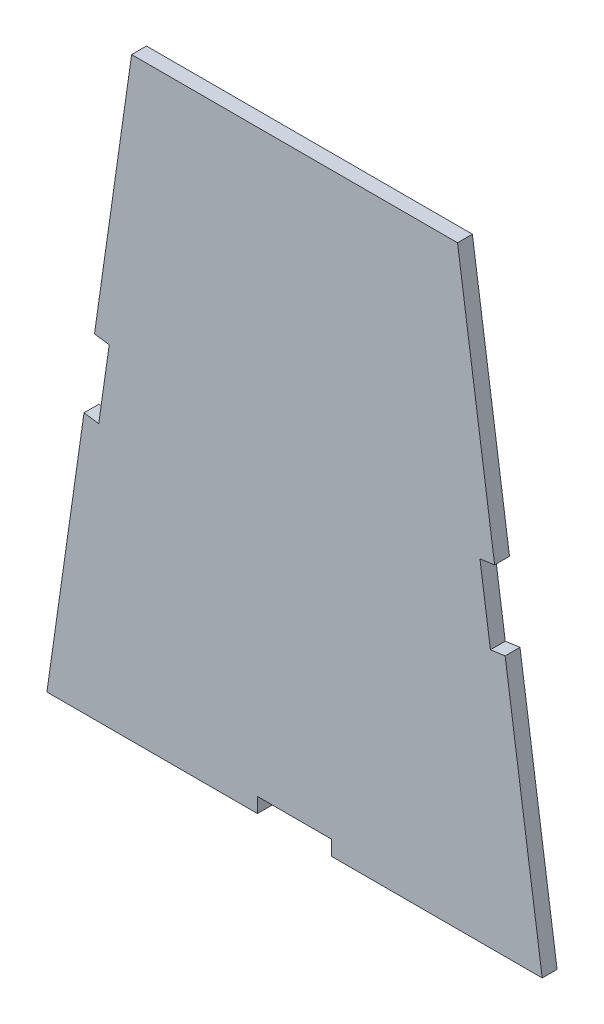
ISO-10303-21;
HEADER;
FILE_DESCRIPTION(('STEP AP214'),'2;1');
FILE_NAME('part.step','',(''),(''),'','','');
FILE_SCHEMA(('AUTOMOTIVE_DESIGN { 1 0 10303 214 1 1 1 1 }'));
ENDSEC;
DATA;
#1=APPLICATION_CONTEXT('core data for automotive mechanical design processes');
#2=APPLICATION_PROTOCOL_DEFINITION('international standard','automotive_design',2000,#1);
#3=PRODUCT_CONTEXT('',#1,'mechanical');
#4=PRODUCT('Part','Part','',(#3));
#5=PRODUCT_RELATED_PRODUCT_CATEGORY('part','',(#4));
#6=PRODUCT_DEFINITION_FORMATION('','',#4);
#7=PRODUCT_DEFINITION_CONTEXT('part definition',#1,'design');
#8=PRODUCT_DEFINITION('design','',#6,#7);
#9=PRODUCT_DEFINITION_SHAPE('','',#8);
#10=(LENGTH_UNIT() NAMED_UNIT(*) SI_UNIT(.MILLI.,.METRE.));
#11=(NAMED_UNIT(*) PLANE_ANGLE_UNIT() SI_UNIT($,.RADIAN.));
#12=(NAMED_UNIT(*) SI_UNIT($,.STERADIAN.) SOLID_ANGLE_UNIT());
#13=UNCERTAINTY_MEASURE_WITH_UNIT(LENGTH_MEASURE(1.E-05),#10,'distance_accuracy_value','');
#14=(GEOMETRIC_REPRESENTATION_CONTEXT(3) GLOBAL_UNCERTAINTY_ASSIGNED_CONTEXT((#13)) GLOBAL_UNIT_ASSIGNED_CONTEXT((#10,
#11,#12)) REPRESENTATION_CONTEXT('',''));
#15=CARTESIAN_POINT('',(0.,0.,0.));
#16=DIRECTION('',(0.,0.,1.));
#17=DIRECTION('',(1.,0.,0.));
#18=AXIS2_PLACEMENT_3D('',#15,#16,#17);
#19=CARTESIAN_POINT('',(-142.129727490012,-86.5401507185033,3.));
#20=DIRECTION('',(0.,1.,0.));
#21=DIRECTION('',(0.,0.,1.));
#22=AXIS2_PLACEMENT_3D('',#19,#20,#21);
#23=PLANE('',#22);
#24=DIRECTION('',(1.,0.,0.));
#25=VECTOR('',#24,1.);
#26=CARTESIAN_POINT('',(-142.129727490012,-86.5401507185033,0.));
#27=LINE('',#26,#25);
#28=CARTESIAN_POINT('',(-142.129727490012,-86.5401507185033,0.));
#29=VERTEX_POINT('',#28);
#30=CARTESIAN_POINT('',(-99.6297274900117,-86.5401507185033,0.));
#31=VERTEX_POINT('',#30);
#32=EDGE_CURVE('E180',#29,#31,#27,.T.);
#33=ORIENTED_EDGE('',*,*,#32,.T.);
#34=DIRECTION('',(0.,0.,-1.));
#35=VECTOR('',#34,1.);
#36=CARTESIAN_POINT('',(-99.6297274900117,-86.5401507185033,3.));
#37=LINE('',#36,#35);
#38=CARTESIAN_POINT('',(-99.6297274900117,-86.5401507185033,3.));
#39=VERTEX_POINT('',#38);
#40=EDGE_CURVE('E11',#39,#31,#37,.T.);
#41=ORIENTED_EDGE('',*,*,#40,.F.);
#42=DIRECTION('',(1.,0.,0.));
#43=VECTOR('',#42,1.);
#44=CARTESIAN_POINT('',(-142.129727490012,-86.5401507185033,3.));
#45=LINE('',#44,#43);
#46=CARTESIAN_POINT('',(-142.129727490012,-86.5401507185033,3.));
#47=VERTEX_POINT('',#46);
#48=EDGE_CURVE('E210',#47,#39,#45,.T.);
#49=ORIENTED_EDGE('',*,*,#48,.F.);
#50=DIRECTION('',(0.,0.,-1.));
#51=VECTOR('',#50,1.);
#52=CARTESIAN_POINT('',(-142.129727490012,-86.5401507185033,3.));
#53=LINE('',#52,#51);
#54=EDGE_CURVE('E176',#47,#29,#53,.T.);
#55=ORIENTED_EDGE('',*,*,#54,.T.);
#56=EDGE_LOOP('',(#33,#41,#49,#55));
#57=FACE_BOUND('',#56,.T.);
#58=ADVANCED_FACE('F36',(#57),#23,.F.);
#59=CARTESIAN_POINT('',(-99.6297274900117,-83.5401507185033,3.));
#60=DIRECTION('',(-1.,0.,0.));
#61=DIRECTION('',(0.,0.,1.));
#62=AXIS2_PLACEMENT_3D('',#59,#60,#61);
#63=PLANE('',#62);
#64=DIRECTION('',(0.,1.,0.));
#65=VECTOR('',#64,1.);
#66=CARTESIAN_POINT('',(-99.6297274900117,-83.5401507185033,0.));
#67=LINE('',#66,#65);
#68=CARTESIAN_POINT('',(-99.6297274900117,-83.5401507185033,0.));
#69=VERTEX_POINT('',#68);
#70=EDGE_CURVE('E183',#31,#69,#67,.T.);
#71=ORIENTED_EDGE('',*,*,#70,.T.);
#72=DIRECTION('',(0.,0.,-1.));
#73=VECTOR('',#72,1.);
#74=CARTESIAN_POINT('',(-99.6297274900117,-83.5401507185033,3.));
#75=LINE('',#74,#73);
#76=CARTESIAN_POINT('',(-99.6297274900117,-83.5401507185033,3.));
#77=VERTEX_POINT('',#76);
#78=EDGE_CURVE('E44',#77,#69,#75,.T.);
#79=ORIENTED_EDGE('',*,*,#78,.F.);
#80=DIRECTION('',(0.,1.,0.));
#81=VECTOR('',#80,1.);
#82=CARTESIAN_POINT('',(-99.6297274900117,-83.5401507185033,3.));
#83=LINE('',#82,#81);
#84=EDGE_CURVE('E119',#39,#77,#83,.T.);
#85=ORIENTED_EDGE('',*,*,#84,.F.);
#86=ORIENTED_EDGE('',*,*,#40,.T.);
#87=EDGE_LOOP('',(#71,#79,#85,#86));
#88=FACE_BOUND('',#87,.T.);
#89=ADVANCED_FACE('F308',(#88),#63,.F.);
#90=CARTESIAN_POINT('',(-99.6297274900117,-83.5401507185033,3.));
#91=DIRECTION('',(0.,1.,0.));
#92=DIRECTION('',(0.,0.,1.));
#93=AXIS2_PLACEMENT_3D('',#90,#91,#92);
#94=PLANE('',#93);
#95=DIRECTION('',(1.,0.,0.));
#96=VECTOR('',#95,1.);
#97=CARTESIAN_POINT('',(-99.6297274900117,-83.5401507185033,0.));
#98=LINE('',#97,#96);
#99=CARTESIAN_POINT('',(-84.6297274900117,-83.5401507185033,0.));
#100=VERTEX_POINT('',#99);
#101=EDGE_CURVE('E185',#69,#100,#98,.T.);
#102=ORIENTED_EDGE('',*,*,#101,.T.);
#103=DIRECTION('',(0.,0.,-1.));
#104=VECTOR('',#103,1.);
#105=CARTESIAN_POINT('',(-84.6297274900117,-83.5401507185033,3.));
#106=LINE('',#105,#104);
#107=CARTESIAN_POINT('',(-84.6297274900117,-83.5401507185033,3.));
#108=VERTEX_POINT('',#107);
#109=EDGE_CURVE('E241',#108,#100,#106,.T.);
#110=ORIENTED_EDGE('',*,*,#109,.F.);
#111=DIRECTION('',(1.,0.,0.));
#112=VECTOR('',#111,1.);
#113=CARTESIAN_POINT('',(-99.6297274900117,-83.5401507185033,3.));
#114=LINE('',#113,#112);
#115=EDGE_CURVE('E249',#77,#108,#114,.T.);
#116=ORIENTED_EDGE('',*,*,#115,.F.);
#117=ORIENTED_EDGE('',*,*,#78,.T.);
#118=EDGE_LOOP('',(#102,#110,#116,#117));
#119=FACE_BOUND('',#118,.T.);
#120=ADVANCED_FACE('F247',(#119),#94,.F.);
#121=CARTESIAN_POINT('',(-84.6297274900117,-83.5401507185033,3.));
#122=DIRECTION('',(1.,0.,0.));
#123=DIRECTION('',(0.,0.,-1.));
#124=AXIS2_PLACEMENT_3D('',#121,#122,#123);
#125=PLANE('',#124);
#126=DIRECTION('',(0.,-1.,0.));
#127=VECTOR('',#126,1.);
#128=CARTESIAN_POINT('',(-84.6297274900117,-83.5401507185033,0.));
#129=LINE('',#128,#127);
#130=CARTESIAN_POINT('',(-84.6297274900117,-86.5401507185033,0.));
#131=VERTEX_POINT('',#130);
#132=EDGE_CURVE('E187',#100,#131,#129,.T.);
#133=ORIENTED_EDGE('',*,*,#132,.T.);
#134=DIRECTION('',(0.,0.,-1.));
#135=VECTOR('',#134,1.);
#136=CARTESIAN_POINT('',(-84.6297274900117,-86.5401507185033,3.));
#137=LINE('',#136,#135);
#138=CARTESIAN_POINT('',(-84.6297274900117,-86.5401507185033,3.));
#139=VERTEX_POINT('',#138);
#140=EDGE_CURVE('E238',#139,#131,#137,.T.);
#141=ORIENTED_EDGE('',*,*,#140,.F.);
#142=DIRECTION('',(0.,-1.,0.));
#143=VECTOR('',#142,1.);
#144=CARTESIAN_POINT('',(-84.6297274900117,-83.5401507185033,3.));
#145=LINE('',#144,#143);
#146=EDGE_CURVE('E267',#108,#139,#145,.T.);
#147=ORIENTED_EDGE('',*,*,#146,.F.);
#148=ORIENTED_EDGE('',*,*,#109,.T.);
#149=EDGE_LOOP('',(#133,#141,#147,#148));
#150=FACE_BOUND('',#149,.T.);
#151=ADVANCED_FACE('F258',(#150),#125,.F.);
#152=CARTESIAN_POINT('',(-84.6297274900117,-86.5401507185033,3.));
#153=DIRECTION('',(0.,1.,0.));
#154=DIRECTION('',(0.,0.,1.));
#155=AXIS2_PLACEMENT_3D('',#152,#153,#154);
#156=PLANE('',#155);
#157=DIRECTION('',(1.,0.,0.));
#158=VECTOR('',#157,1.);
#159=CARTESIAN_POINT('',(-84.6297274900117,-86.5401507185033,0.));
#160=LINE('',#159,#158);
#161=CARTESIAN_POINT('',(-42.1297274900117,-86.5401507185033,0.));
#162=VERTEX_POINT('',#161);
#163=EDGE_CURVE('E189',#131,#162,#160,.T.);
#164=ORIENTED_EDGE('',*,*,#163,.T.);
#165=DIRECTION('',(0.,0.,-1.));
#166=VECTOR('',#165,1.);
#167=CARTESIAN_POINT('',(-42.1297274900117,-86.5401507185033,3.));
#168=LINE('',#167,#166);
#169=CARTESIAN_POINT('',(-42.1297274900117,-86.5401507185033,3.));
#170=VERTEX_POINT('',#169);
#171=EDGE_CURVE('E235',#170,#162,#168,.T.);
#172=ORIENTED_EDGE('',*,*,#171,.F.);
#173=DIRECTION('',(1.,0.,0.));
#174=VECTOR('',#173,1.);
#175=CARTESIAN_POINT('',(-84.6297274900117,-86.5401507185033,3.));
#176=LINE('',#175,#174);
#177=EDGE_CURVE('E264',#139,#170,#176,.T.);
#178=ORIENTED_EDGE('',*,*,#177,.F.);
#179=ORIENTED_EDGE('',*,*,#140,.T.);
#180=EDGE_LOOP('',(#164,#172,#178,#179));
#181=FACE_BOUND('',#180,.T.);
#182=ADVANCED_FACE('F262',(#181),#156,.F.);
#183=CARTESIAN_POINT('',(-42.1297274900117,-86.5401507185033,3.));
#184=DIRECTION('',(-0.98999843510876,-0.141078341648204,0.));
#185=DIRECTION('',(0.141078341648204,-0.98999843510876,0.));
#186=AXIS2_PLACEMENT_3D('',#183,#184,#185);
#187=PLANE('',#186);
#188=DIRECTION('',(-0.141078341648204,0.989998435108759,0.));
#189=VECTOR('',#188,1.);
#190=CARTESIAN_POINT('',(-42.1297274900117,-86.5401507185033,0.));
#191=LINE('',#190,#189);
#192=CARTESIAN_POINT('',(-49.6218559670951,-33.9651389818189,0.));
#193=VERTEX_POINT('',#192);
#194=EDGE_CURVE('E191',#162,#193,#191,.T.);
#195=ORIENTED_EDGE('',*,*,#194,.T.);
#196=DIRECTION('',(0.,0.,-1.));
#197=VECTOR('',#196,1.);
#198=CARTESIAN_POINT('',(-49.6218559670951,-33.9651389818189,3.));
#199=LINE('',#198,#197);
#200=CARTESIAN_POINT('',(-49.6218559670951,-33.9651389818189,3.));
#201=VERTEX_POINT('',#200);
#202=EDGE_CURVE('E232',#201,#193,#199,.T.);
#203=ORIENTED_EDGE('',*,*,#202,.F.);
#204=DIRECTION('',(-0.141078341648204,0.989998435108759,0.));
#205=VECTOR('',#204,1.);
#206=CARTESIAN_POINT('',(-42.1297274900117,-86.5401507185033,3.));
#207=LINE('',#206,#205);
#208=EDGE_CURVE('E266',#170,#201,#207,.T.);
#209=ORIENTED_EDGE('',*,*,#208,.F.);
#210=ORIENTED_EDGE('',*,*,#171,.T.);
#211=EDGE_LOOP('',(#195,#203,#209,#210));
#212=FACE_BOUND('',#211,.T.);
#213=ADVANCED_FACE('F321',(#212),#187,.F.);
#214=CARTESIAN_POINT('',(-49.6218559670951,-33.9651389818189,3.));
#215=DIRECTION('',(0.141078341648203,-0.98999843510876,0.));
#216=DIRECTION('',(0.98999843510876,0.141078341648203,0.));
#217=AXIS2_PLACEMENT_3D('',#214,#215,#216);
#218=PLANE('',#217);
#219=DIRECTION('',(-0.98999843510876,-0.141078341648203,0.));
#220=VECTOR('',#219,1.);
#221=CARTESIAN_POINT('',(-49.6218559670951,-33.9651389818189,0.));
#222=LINE('',#221,#220);
#223=CARTESIAN_POINT('',(-52.5918512724221,-34.3883740067636,0.));
#224=VERTEX_POINT('',#223);
#225=EDGE_CURVE('E193',#193,#224,#222,.T.);
#226=ORIENTED_EDGE('',*,*,#225,.T.);
#227=DIRECTION('',(0.,0.,-1.));
#228=VECTOR('',#227,1.);
#229=CARTESIAN_POINT('',(-52.5918512724221,-34.3883740067636,3.));
#230=LINE('',#229,#228);
#231=CARTESIAN_POINT('',(-52.5918512724221,-34.3883740067636,3.));
#232=VERTEX_POINT('',#231);
#233=EDGE_CURVE('E229',#232,#224,#230,.T.);
#234=ORIENTED_EDGE('',*,*,#233,.F.);
#235=DIRECTION('',(-0.98999843510876,-0.141078341648203,0.));
#236=VECTOR('',#235,1.);
#237=CARTESIAN_POINT('',(-49.6218559670951,-33.9651389818189,3.));
#238=LINE('',#237,#236);
#239=EDGE_CURVE('E269',#201,#232,#238,.T.);
#240=ORIENTED_EDGE('',*,*,#239,.F.);
#241=ORIENTED_EDGE('',*,*,#202,.T.);
#242=EDGE_LOOP('',(#226,#234,#240,#241));
#243=FACE_BOUND('',#242,.T.);
#244=ADVANCED_FACE('F324',(#243),#218,.F.);
#245=CARTESIAN_POINT('',(-52.5918512724221,-34.3883740067636,3.));
#246=DIRECTION('',(-0.989998435108767,-0.141078341648153,0.));
#247=DIRECTION('',(0.141078341648153,-0.989998435108767,0.));
#248=AXIS2_PLACEMENT_3D('',#245,#246,#247);
#249=PLANE('',#248);
#250=DIRECTION('',(-0.141078341648153,0.989998435108767,0.));
#251=VECTOR('',#250,1.);
#252=CARTESIAN_POINT('',(-52.5918512724221,-34.3883740067636,0.));
#253=LINE('',#252,#251);
#254=CARTESIAN_POINT('',(-54.7080263971444,-19.5383974801321,0.));
#255=VERTEX_POINT('',#254);
#256=EDGE_CURVE('E195',#224,#255,#253,.T.);
#257=ORIENTED_EDGE('',*,*,#256,.T.);
#258=DIRECTION('',(0.,0.,-1.));
#259=VECTOR('',#258,1.);
#260=CARTESIAN_POINT('',(-54.7080263971444,-19.5383974801321,3.));
#261=LINE('',#260,#259);
#262=CARTESIAN_POINT('',(-54.7080263971444,-19.5383974801321,3.));
#263=VERTEX_POINT('',#262);
#264=EDGE_CURVE('E226',#263,#255,#261,.T.);
#265=ORIENTED_EDGE('',*,*,#264,.F.);
#266=DIRECTION('',(-0.141078341648153,0.989998435108767,0.));
#267=VECTOR('',#266,1.);
#268=CARTESIAN_POINT('',(-52.5918512724221,-34.3883740067636,3.));
#269=LINE('',#268,#267);
#270=EDGE_CURVE('E275',#232,#263,#269,.T.);
#271=ORIENTED_EDGE('',*,*,#270,.F.);
#272=ORIENTED_EDGE('',*,*,#233,.T.);
#273=EDGE_LOOP('',(#257,#265,#271,#272));
#274=FACE_BOUND('',#273,.T.);
#275=ADVANCED_FACE('F328',(#274),#249,.F.);
#276=CARTESIAN_POINT('',(-54.7080263971444,-19.5383974801321,3.));
#277=DIRECTION('',(-0.141078341648205,0.989998435108759,0.));
#278=DIRECTION('',(-0.989998435108759,-0.141078341648205,0.));
#279=AXIS2_PLACEMENT_3D('',#276,#277,#278);
#280=PLANE('',#279);
#281=DIRECTION('',(0.989998435108759,0.141078341648205,0.));
#282=VECTOR('',#281,1.);
#283=CARTESIAN_POINT('',(-54.7080263971444,-19.5383974801321,0.));
#284=LINE('',#283,#282);
#285=CARTESIAN_POINT('',(-51.7380310918181,-19.1151624551875,0.));
#286=VERTEX_POINT('',#285);
#287=EDGE_CURVE('E197',#255,#286,#284,.T.);
#288=ORIENTED_EDGE('',*,*,#287,.T.);
#289=DIRECTION('',(0.,0.,-1.));
#290=VECTOR('',#289,1.);
#291=CARTESIAN_POINT('',(-51.7380310918181,-19.1151624551875,3.));
#292=LINE('',#291,#290);
#293=CARTESIAN_POINT('',(-51.7380310918181,-19.1151624551875,3.));
#294=VERTEX_POINT('',#293);
#295=EDGE_CURVE('E223',#294,#286,#292,.T.);
#296=ORIENTED_EDGE('',*,*,#295,.F.);
#297=DIRECTION('',(0.989998435108759,0.141078341648205,0.));
#298=VECTOR('',#297,1.);
#299=CARTESIAN_POINT('',(-54.7080263971444,-19.5383974801321,3.));
#300=LINE('',#299,#298);
#301=EDGE_CURVE('E277',#263,#294,#300,.T.);
#302=ORIENTED_EDGE('',*,*,#301,.F.);
#303=ORIENTED_EDGE('',*,*,#264,.T.);
#304=EDGE_LOOP('',(#288,#296,#302,#303));
#305=FACE_BOUND('',#304,.T.);
#306=ADVANCED_FACE('F332',(#305),#280,.F.);
#307=CARTESIAN_POINT('',(-51.7380310918181,-19.1151624551875,3.));
#308=DIRECTION('',(-0.989998435108759,-0.141078341648204,0.));
#309=DIRECTION('',(0.141078341648204,-0.98999843510876,0.));
#310=AXIS2_PLACEMENT_3D('',#307,#308,#309);
#311=PLANE('',#310);
#312=DIRECTION('',(-0.141078341648204,0.98999843510876,0.));
#313=VECTOR('',#312,1.);
#314=CARTESIAN_POINT('',(-51.7380310918181,-19.1151624551875,0.));
#315=LINE('',#314,#313);
#316=CARTESIAN_POINT('',(-59.2301595689014,33.4598492814968,0.));
#317=VERTEX_POINT('',#316);
#318=EDGE_CURVE('E199',#286,#317,#315,.T.);
#319=ORIENTED_EDGE('',*,*,#318,.T.);
#320=DIRECTION('',(0.,0.,-1.));
#321=VECTOR('',#320,1.);
#322=CARTESIAN_POINT('',(-59.2301595689014,33.4598492814968,3.));
#323=LINE('',#322,#321);
#324=CARTESIAN_POINT('',(-59.2301595689014,33.4598492814968,3.));
#325=VERTEX_POINT('',#324);
#326=EDGE_CURVE('E220',#325,#317,#323,.T.);
#327=ORIENTED_EDGE('',*,*,#326,.F.);
#328=DIRECTION('',(-0.141078341648204,0.98999843510876,0.));
#329=VECTOR('',#328,1.);
#330=CARTESIAN_POINT('',(-51.7380310918181,-19.1151624551875,3.));
#331=LINE('',#330,#329);
#332=EDGE_CURVE('E279',#294,#325,#331,.T.);
#333=ORIENTED_EDGE('',*,*,#332,.F.);
#334=ORIENTED_EDGE('',*,*,#295,.T.);
#335=EDGE_LOOP('',(#319,#327,#333,#334));
#336=FACE_BOUND('',#335,.T.);
#337=ADVANCED_FACE('F336',(#336),#311,.F.);
#338=CARTESIAN_POINT('',(-59.2301595689014,33.4598492814968,3.));
#339=DIRECTION('',(0.,-1.,0.));
#340=DIRECTION('',(1.,0.,0.));
#341=AXIS2_PLACEMENT_3D('',#338,#339,#340);
#342=PLANE('',#341);
#343=DIRECTION('',(-1.,0.,0.));
#344=VECTOR('',#343,1.);
#345=CARTESIAN_POINT('',(-59.2301595689014,33.4598492814968,0.));
#346=LINE('',#345,#344);
#347=CARTESIAN_POINT('',(-125.029295411123,33.4598492814969,0.));
#348=VERTEX_POINT('',#347);
#349=EDGE_CURVE('E201',#317,#348,#346,.T.);
#350=ORIENTED_EDGE('',*,*,#349,.T.);
#351=DIRECTION('',(0.,0.,-1.));
#352=VECTOR('',#351,1.);
#353=CARTESIAN_POINT('',(-125.029295411123,33.4598492814969,3.));
#354=LINE('',#353,#352);
#355=CARTESIAN_POINT('',(-125.029295411123,33.4598492814969,3.));
#356=VERTEX_POINT('',#355);
#357=EDGE_CURVE('E217',#356,#348,#354,.T.);
#358=ORIENTED_EDGE('',*,*,#357,.F.);
#359=DIRECTION('',(-1.,0.,0.));
#360=VECTOR('',#359,1.);
#361=CARTESIAN_POINT('',(-59.2301595689014,33.4598492814968,3.));
#362=LINE('',#361,#360);
#363=EDGE_CURVE('E281',#325,#356,#362,.T.);
#364=ORIENTED_EDGE('',*,*,#363,.F.);
#365=ORIENTED_EDGE('',*,*,#326,.T.);
#366=EDGE_LOOP('',(#350,#358,#364,#365));
#367=FACE_BOUND('',#366,.T.);
#368=ADVANCED_FACE('F340',(#367),#342,.F.);
#369=CARTESIAN_POINT('',(-132.521423888206,-19.1151624551875,3.));
#370=DIRECTION('',(0.989998435108761,-0.141078341648193,0.));
#371=DIRECTION('',(0.141078341648193,0.989998435108761,0.));
#372=AXIS2_PLACEMENT_3D('',#369,#370,#371);
#373=PLANE('',#372);
#374=DIRECTION('',(-0.141078341648193,-0.989998435108761,0.));
#375=VECTOR('',#374,1.);
#376=CARTESIAN_POINT('',(-132.521423888206,-19.1151624551875,0.));
#377=LINE('',#376,#375);
#378=CARTESIAN_POINT('',(-132.521423888206,-19.1151624551875,0.));
#379=VERTEX_POINT('',#378);
#380=EDGE_CURVE('E203',#348,#379,#377,.T.);
#381=ORIENTED_EDGE('',*,*,#380,.T.);
#382=DIRECTION('',(0.,0.,-1.));
#383=VECTOR('',#382,1.);
#384=CARTESIAN_POINT('',(-132.521423888206,-19.1151624551875,3.));
#385=LINE('',#384,#383);
#386=CARTESIAN_POINT('',(-132.521423888206,-19.1151624551875,3.));
#387=VERTEX_POINT('',#386);
#388=EDGE_CURVE('E214',#387,#379,#385,.T.);
#389=ORIENTED_EDGE('',*,*,#388,.F.);
#390=DIRECTION('',(-0.141078341648193,-0.989998435108761,0.));
#391=VECTOR('',#390,1.);
#392=CARTESIAN_POINT('',(-132.521423888206,-19.1151624551875,3.));
#393=LINE('',#392,#391);
#394=EDGE_CURVE('E283',#356,#387,#393,.T.);
#395=ORIENTED_EDGE('',*,*,#394,.F.);
#396=ORIENTED_EDGE('',*,*,#357,.T.);
#397=EDGE_LOOP('',(#381,#389,#395,#396));
#398=FACE_BOUND('',#397,.T.);
#399=ADVANCED_FACE('F289',(#398),#373,.F.);
#400=CARTESIAN_POINT('',(-129.551428582879,-19.5383974801321,3.));
#401=DIRECTION('',(0.141078341648205,0.989998435108759,0.));
#402=DIRECTION('',(-0.98999843510876,0.141078341648205,0.));
#403=AXIS2_PLACEMENT_3D('',#400,#401,#402);
#404=PLANE('',#403);
#405=DIRECTION('',(0.989998435108759,-0.141078341648205,0.));
#406=VECTOR('',#405,1.);
#407=CARTESIAN_POINT('',(-129.551428582879,-19.5383974801321,0.));
#408=LINE('',#407,#406);
#409=CARTESIAN_POINT('',(-129.551428582879,-19.5383974801321,0.));
#410=VERTEX_POINT('',#409);
#411=EDGE_CURVE('E205',#379,#410,#408,.T.);
#412=ORIENTED_EDGE('',*,*,#411,.T.);
#413=DIRECTION('',(0.,0.,-1.));
#414=VECTOR('',#413,1.);
#415=CARTESIAN_POINT('',(-129.551428582879,-19.5383974801321,3.));
#416=LINE('',#415,#414);
#417=CARTESIAN_POINT('',(-129.551428582879,-19.5383974801321,3.));
#418=VERTEX_POINT('',#417);
#419=EDGE_CURVE('E171',#418,#410,#416,.T.);
#420=ORIENTED_EDGE('',*,*,#419,.F.);
#421=DIRECTION('',(0.989998435108759,-0.141078341648205,0.));
#422=VECTOR('',#421,1.);
#423=CARTESIAN_POINT('',(-129.551428582879,-19.5383974801321,3.));
#424=LINE('',#423,#422);
#425=EDGE_CURVE('E162',#387,#418,#424,.T.);
#426=ORIENTED_EDGE('',*,*,#425,.F.);
#427=ORIENTED_EDGE('',*,*,#388,.T.);
#428=EDGE_LOOP('',(#412,#420,#426,#427));
#429=FACE_BOUND('',#428,.T.);
#430=ADVANCED_FACE('F293',(#429),#404,.F.);
#431=CARTESIAN_POINT('',(-131.667603707602,-34.3883740067636,3.));
#432=DIRECTION('',(0.989998435108767,-0.141078341648155,0.));
#433=DIRECTION('',(0.141078341648155,0.989998435108767,0.));
#434=AXIS2_PLACEMENT_3D('',#431,#432,#433);
#435=PLANE('',#434);
#436=DIRECTION('',(-0.141078341648155,-0.989998435108767,0.));
#437=VECTOR('',#436,1.);
#438=CARTESIAN_POINT('',(-131.667603707602,-34.3883740067636,0.));
#439=LINE('',#438,#437);
#440=CARTESIAN_POINT('',(-131.667603707602,-34.3883740067636,0.));
#441=VERTEX_POINT('',#440);
#442=EDGE_CURVE('E170',#410,#441,#439,.T.);
#443=ORIENTED_EDGE('',*,*,#442,.T.);
#444=DIRECTION('',(0.,0.,-1.));
#445=VECTOR('',#444,1.);
#446=CARTESIAN_POINT('',(-131.667603707602,-34.3883740067636,3.));
#447=LINE('',#446,#445);
#448=CARTESIAN_POINT('',(-131.667603707602,-34.3883740067636,3.));
#449=VERTEX_POINT('',#448);
#450=EDGE_CURVE('E167',#449,#441,#447,.T.);
#451=ORIENTED_EDGE('',*,*,#450,.F.);
#452=DIRECTION('',(-0.141078341648155,-0.989998435108767,0.));
#453=VECTOR('',#452,1.);
#454=CARTESIAN_POINT('',(-131.667603707602,-34.3883740067636,3.));
#455=LINE('',#454,#453);
#456=EDGE_CURVE('E156',#418,#449,#455,.T.);
#457=ORIENTED_EDGE('',*,*,#456,.F.);
#458=ORIENTED_EDGE('',*,*,#419,.T.);
#459=EDGE_LOOP('',(#443,#451,#457,#458));
#460=FACE_BOUND('',#459,.T.);
#461=ADVANCED_FACE('F168',(#460),#435,.F.);
#462=CARTESIAN_POINT('',(-134.637599012929,-33.9651389818189,3.));
#463=DIRECTION('',(-0.141078341648204,-0.98999843510876,0.));
#464=DIRECTION('',(0.98999843510876,-0.141078341648204,0.));
#465=AXIS2_PLACEMENT_3D('',#462,#463,#464);
#466=PLANE('',#465);
#467=DIRECTION('',(-0.98999843510876,0.141078341648204,0.));
#468=VECTOR('',#467,1.);
#469=CARTESIAN_POINT('',(-134.637599012929,-33.9651389818189,0.));
#470=LINE('',#469,#468);
#471=CARTESIAN_POINT('',(-134.637599012929,-33.9651389818189,0.));
#472=VERTEX_POINT('',#471);
#473=EDGE_CURVE('E105',#441,#472,#470,.T.);
#474=ORIENTED_EDGE('',*,*,#473,.T.);
#475=DIRECTION('',(0.,0.,-1.));
#476=VECTOR('',#475,1.);
#477=CARTESIAN_POINT('',(-134.637599012929,-33.9651389818189,3.));
#478=LINE('',#477,#476);
#479=CARTESIAN_POINT('',(-134.637599012929,-33.9651389818189,3.));
#480=VERTEX_POINT('',#479);
#481=EDGE_CURVE('E172',#480,#472,#478,.T.);
#482=ORIENTED_EDGE('',*,*,#481,.F.);
#483=DIRECTION('',(-0.98999843510876,0.141078341648204,0.));
#484=VECTOR('',#483,1.);
#485=CARTESIAN_POINT('',(-134.637599012929,-33.9651389818189,3.));
#486=LINE('',#485,#484);
#487=EDGE_CURVE('E160',#449,#480,#486,.T.);
#488=ORIENTED_EDGE('',*,*,#487,.F.);
#489=ORIENTED_EDGE('',*,*,#450,.T.);
#490=EDGE_LOOP('',(#474,#482,#488,#489));
#491=FACE_BOUND('',#490,.T.);
#492=ADVANCED_FACE('F174',(#491),#466,.F.);
#493=CARTESIAN_POINT('',(-142.129727490012,-86.5401507185033,3.));
#494=DIRECTION('',(0.989998435108761,-0.141078341648195,0.));
#495=DIRECTION('',(0.141078341648195,0.989998435108761,0.));
#496=AXIS2_PLACEMENT_3D('',#493,#494,#495);
#497=PLANE('',#496);
#498=DIRECTION('',(-0.141078341648195,-0.989998435108761,0.));
#499=VECTOR('',#498,1.);
#500=CARTESIAN_POINT('',(-142.129727490012,-86.5401507185033,0.));
#501=LINE('',#500,#499);
#502=EDGE_CURVE('E111',#472,#29,#501,.T.);
#503=ORIENTED_EDGE('',*,*,#502,.T.);
#504=ORIENTED_EDGE('',*,*,#54,.F.);
#505=DIRECTION('',(-0.141078341648195,-0.989998435108761,0.));
#506=VECTOR('',#505,1.);
#507=CARTESIAN_POINT('',(-142.129727490012,-86.5401507185033,3.));
#508=LINE('',#507,#506);
#509=EDGE_CURVE('E52',#480,#47,#508,.T.);
#510=ORIENTED_EDGE('',*,*,#509,.F.);
#511=ORIENTED_EDGE('',*,*,#481,.T.);
#512=EDGE_LOOP('',(#503,#504,#510,#511));
#513=FACE_BOUND('',#512,.T.);
#514=ADVANCED_FACE('F297',(#513),#497,.F.);
#515=CARTESIAN_POINT('',(0.,0.,3.));
#516=DIRECTION('',(0.,0.,-1.));
#517=DIRECTION('',(-1.,0.,0.));
#518=AXIS2_PLACEMENT_3D('',#515,#516,#517);
#519=PLANE('',#518);
#520=ORIENTED_EDGE('',*,*,#48,.T.);
#521=ORIENTED_EDGE('',*,*,#84,.T.);
#522=ORIENTED_EDGE('',*,*,#115,.T.);
#523=ORIENTED_EDGE('',*,*,#146,.T.);
#524=ORIENTED_EDGE('',*,*,#177,.T.);
#525=ORIENTED_EDGE('',*,*,#208,.T.);
#526=ORIENTED_EDGE('',*,*,#239,.T.);
#527=ORIENTED_EDGE('',*,*,#270,.T.);
#528=ORIENTED_EDGE('',*,*,#301,.T.);
#529=ORIENTED_EDGE('',*,*,#332,.T.);
#530=ORIENTED_EDGE('',*,*,#363,.T.);
#531=ORIENTED_EDGE('',*,*,#394,.T.);
#532=ORIENTED_EDGE('',*,*,#425,.T.);
#533=ORIENTED_EDGE('',*,*,#456,.T.);
#534=ORIENTED_EDGE('',*,*,#487,.T.);
#535=ORIENTED_EDGE('',*,*,#509,.T.);
#536=EDGE_LOOP('',(#520,#521,#522,#523,#524,#525,#526,#527,#528,#529,#530,#531,#532,#533,#534,#535));
#537=FACE_BOUND('',#536,.T.);
#538=ADVANCED_FACE('F158',(#537),#519,.F.);
#539=CARTESIAN_POINT('',(0.,0.,0.));
#540=DIRECTION('',(0.,0.,-1.));
#541=DIRECTION('',(-1.,0.,0.));
#542=AXIS2_PLACEMENT_3D('',#539,#540,#541);
#543=PLANE('',#542);
#544=ORIENTED_EDGE('',*,*,#32,.F.);
#545=ORIENTED_EDGE('',*,*,#502,.F.);
#546=ORIENTED_EDGE('',*,*,#473,.F.);
#547=ORIENTED_EDGE('',*,*,#442,.F.);
#548=ORIENTED_EDGE('',*,*,#411,.F.);
#549=ORIENTED_EDGE('',*,*,#380,.F.);
#550=ORIENTED_EDGE('',*,*,#349,.F.);
#551=ORIENTED_EDGE('',*,*,#318,.F.);
#552=ORIENTED_EDGE('',*,*,#287,.F.);
#553=ORIENTED_EDGE('',*,*,#256,.F.);
#554=ORIENTED_EDGE('',*,*,#225,.F.);
#555=ORIENTED_EDGE('',*,*,#194,.F.);
#556=ORIENTED_EDGE('',*,*,#163,.F.);
#557=ORIENTED_EDGE('',*,*,#132,.F.);
#558=ORIENTED_EDGE('',*,*,#101,.F.);
#559=ORIENTED_EDGE('',*,*,#70,.F.);
#560=EDGE_LOOP('',(#544,#545,#546,#547,#548,#549,#550,#551,#552,#553,#554,#555,#556,#557,#558,#559));
#561=FACE_BOUND('',#560,.T.);
#562=ADVANCED_FACE('F253',(#561),#543,.T.);
#563=CLOSED_SHELL('',(#58,#89,#120,#151,#182,#213,#244,#275,#306,#337,#368,#399,#430,#461,#492,
#514,#538,#562));
#564=MANIFOLD_SOLID_BREP('B2',#563);
#565=ADVANCED_BREP_SHAPE_REPRESENTATION('',(#18,#564),#14);
#566=SHAPE_DEFINITION_REPRESENTATION(#9,#565);
ENDSEC;
END-ISO-10303-21;
